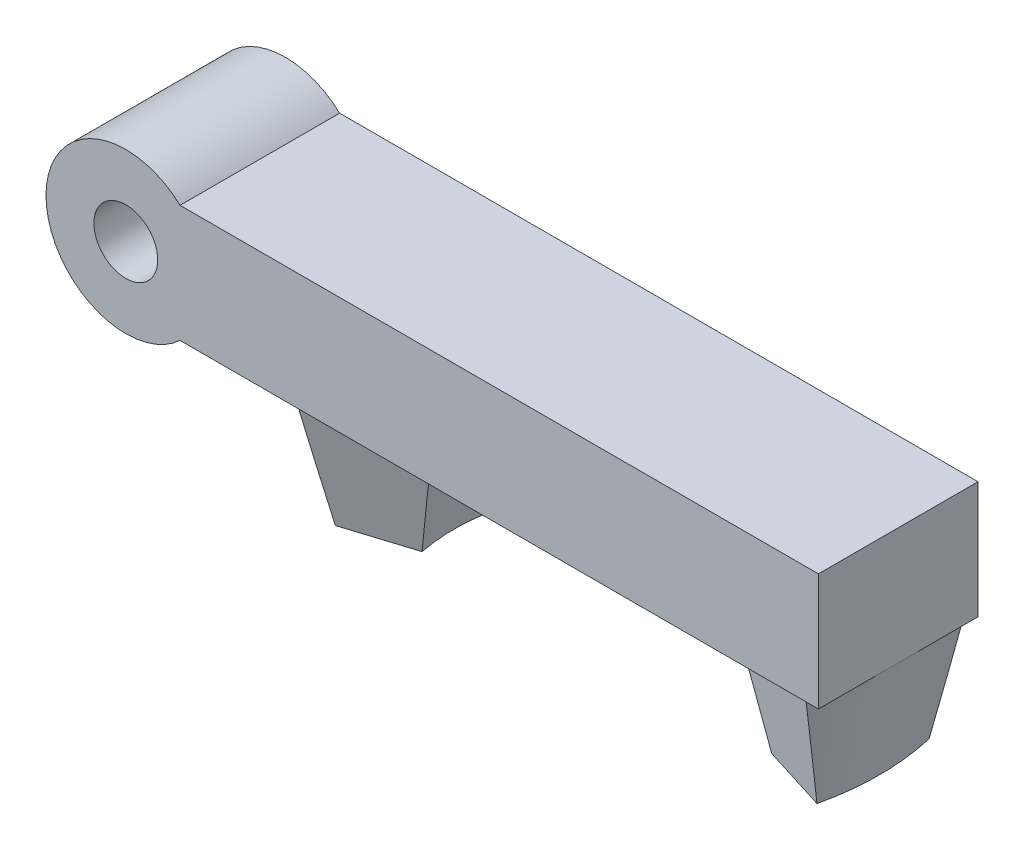
ISO-10303-21;
HEADER;
FILE_DESCRIPTION(('STEP AP214'),'2;1');
FILE_NAME('part.step','',(''),(''),'','','');
FILE_SCHEMA(('AUTOMOTIVE_DESIGN { 1 0 10303 214 1 1 1 1 }'));
ENDSEC;
DATA;
#1=APPLICATION_CONTEXT('core data for automotive mechanical design processes');
#2=APPLICATION_PROTOCOL_DEFINITION('international standard','automotive_design',2000,#1);
#3=PRODUCT_CONTEXT('',#1,'mechanical');
#4=PRODUCT('Part','Part','',(#3));
#5=PRODUCT_RELATED_PRODUCT_CATEGORY('part','',(#4));
#6=PRODUCT_DEFINITION_FORMATION('','',#4);
#7=PRODUCT_DEFINITION_CONTEXT('part definition',#1,'design');
#8=PRODUCT_DEFINITION('design','',#6,#7);
#9=PRODUCT_DEFINITION_SHAPE('','',#8);
#10=(LENGTH_UNIT() NAMED_UNIT(*) SI_UNIT(.MILLI.,.METRE.));
#11=(NAMED_UNIT(*) PLANE_ANGLE_UNIT() SI_UNIT($,.RADIAN.));
#12=(NAMED_UNIT(*) SI_UNIT($,.STERADIAN.) SOLID_ANGLE_UNIT());
#13=UNCERTAINTY_MEASURE_WITH_UNIT(LENGTH_MEASURE(1.E-05),#10,'distance_accuracy_value','');
#14=(GEOMETRIC_REPRESENTATION_CONTEXT(3) GLOBAL_UNCERTAINTY_ASSIGNED_CONTEXT((#13)) GLOBAL_UNIT_ASSIGNED_CONTEXT((#10,
#11,#12)) REPRESENTATION_CONTEXT('',''));
#15=CARTESIAN_POINT('',(0.,0.,0.));
#16=DIRECTION('',(0.,0.,1.));
#17=DIRECTION('',(1.,0.,0.));
#18=AXIS2_PLACEMENT_3D('',#15,#16,#17);
#19=CARTESIAN_POINT('',(32.5495097567961,-2.75,7.5));
#20=DIRECTION('',(0.,1.,0.));
#21=DIRECTION('',(0.,0.,1.));
#22=AXIS2_PLACEMENT_3D('',#19,#20,#21);
#23=PLANE('',#22);
#24=CARTESIAN_POINT('',(20.0495097567961,-2.75,3.75));
#25=DIRECTION('',(0.,-1.,0.));
#26=DIRECTION('',(0.,0.,-1.));
#27=AXIS2_PLACEMENT_3D('',#24,#25,#26);
#28=CIRCLE('',#27,12.5);
#29=CARTESIAN_POINT('',(8.12526973908429,-2.75,7.5));
#30=VERTEX_POINT('',#29);
#31=CARTESIAN_POINT('',(8.1252697390843,-2.75,0.));
#32=VERTEX_POINT('',#31);
#33=EDGE_CURVE('E151',#30,#32,#28,.T.);
#34=ORIENTED_EDGE('',*,*,#33,.F.);
#35=DIRECTION('',(1.,0.,0.));
#36=VECTOR('',#35,1.);
#37=CARTESIAN_POINT('',(22.0495097567963,-2.75,7.5));
#38=LINE('',#37,#36);
#39=CARTESIAN_POINT('',(2.54950975679639,-2.75,7.5));
#40=VERTEX_POINT('',#39);
#41=EDGE_CURVE('E130',#40,#30,#38,.T.);
#42=ORIENTED_EDGE('',*,*,#41,.F.);
#43=DIRECTION('',(0.,0.,-1.));
#44=VECTOR('',#43,1.);
#45=CARTESIAN_POINT('',(2.54950975679639,-2.75,7.5));
#46=LINE('',#45,#44);
#47=CARTESIAN_POINT('',(2.54950975679639,-2.75,0.));
#48=VERTEX_POINT('',#47);
#49=EDGE_CURVE('E11',#40,#48,#46,.T.);
#50=ORIENTED_EDGE('',*,*,#49,.T.);
#51=DIRECTION('',(1.,0.,0.));
#52=VECTOR('',#51,1.);
#53=CARTESIAN_POINT('',(32.5495097567961,-2.75,0.));
#54=LINE('',#53,#52);
#55=EDGE_CURVE('E152',#48,#32,#54,.T.);
#56=ORIENTED_EDGE('',*,*,#55,.T.);
#57=EDGE_LOOP('',(#34,#42,#50,#56));
#58=FACE_BOUND('',#57,.T.);
#59=ADVANCED_FACE('F39',(#58),#23,.F.);
#60=DIRECTION('',(0.953939201416946,0.,0.3));
#61=VECTOR('',#60,1.);
#62=CARTESIAN_POINT('',(8.12526973908429,-2.75,0.));
#63=LINE('',#62,#61);
#64=CARTESIAN_POINT('',(12.894965746169,-2.75,1.5));
#65=VERTEX_POINT('',#64);
#66=EDGE_CURVE('E158',#32,#65,#63,.T.);
#67=ORIENTED_EDGE('',*,*,#66,.F.);
#68=CARTESIAN_POINT('',(31.9737497745079,-2.75,0.));
#69=VERTEX_POINT('',#68);
#70=EDGE_CURVE('E370',#32,#69,#54,.T.);
#71=ORIENTED_EDGE('',*,*,#70,.T.);
#72=DIRECTION('',(0.953939201416946,0.,-0.3));
#73=VECTOR('',#72,1.);
#74=CARTESIAN_POINT('',(31.9737497745079,-2.75,0.));
#75=LINE('',#74,#73);
#76=CARTESIAN_POINT('',(27.2040537674232,-2.75,1.5));
#77=VERTEX_POINT('',#76);
#78=EDGE_CURVE('E265',#77,#69,#75,.T.);
#79=ORIENTED_EDGE('',*,*,#78,.F.);
#80=CARTESIAN_POINT('',(20.0495097567961,-2.75,3.75));
#81=DIRECTION('',(0.,1.,0.));
#82=DIRECTION('',(0.,0.,-1.));
#83=AXIS2_PLACEMENT_3D('',#80,#81,#82);
#84=CIRCLE('',#83,7.5);
#85=CARTESIAN_POINT('',(27.2040537674232,-2.75,6.));
#86=VERTEX_POINT('',#85);
#87=EDGE_CURVE('E275',#86,#77,#84,.T.);
#88=ORIENTED_EDGE('',*,*,#87,.F.);
#89=DIRECTION('',(-0.953939201416946,0.,-0.3));
#90=VECTOR('',#89,1.);
#91=CARTESIAN_POINT('',(31.9737497745079,-2.75,7.5));
#92=LINE('',#91,#90);
#93=CARTESIAN_POINT('',(31.9737497745079,-2.75,7.5));
#94=VERTEX_POINT('',#93);
#95=EDGE_CURVE('E146',#94,#86,#92,.T.);
#96=ORIENTED_EDGE('',*,*,#95,.F.);
#97=EDGE_CURVE('E133',#30,#94,#38,.T.);
#98=ORIENTED_EDGE('',*,*,#97,.F.);
#99=DIRECTION('',(-0.953939201416946,0.,0.3));
#100=VECTOR('',#99,1.);
#101=CARTESIAN_POINT('',(8.12526973908429,-2.75,7.5));
#102=LINE('',#101,#100);
#103=CARTESIAN_POINT('',(12.894965746169,-2.75,6.));
#104=VERTEX_POINT('',#103);
#105=EDGE_CURVE('E60',#104,#30,#102,.T.);
#106=ORIENTED_EDGE('',*,*,#105,.F.);
#107=CARTESIAN_POINT('',(20.0495097567961,-2.75,3.75));
#108=DIRECTION('',(0.,1.,0.));
#109=DIRECTION('',(0.,0.,1.));
#110=AXIS2_PLACEMENT_3D('',#107,#108,#109);
#111=CIRCLE('',#110,7.5);
#112=EDGE_CURVE('E55',#65,#104,#111,.T.);
#113=ORIENTED_EDGE('',*,*,#112,.F.);
#114=EDGE_LOOP('',(#67,#71,#79,#88,#96,#98,#106,#113));
#115=FACE_BOUND('',#114,.T.);
#116=ADVANCED_FACE('F144',(#115),#23,.F.);
#117=CARTESIAN_POINT('',(20.0495097567961,-2.75,3.75));
#118=DIRECTION('',(0.,-1.,0.));
#119=DIRECTION('',(0.,0.,1.));
#120=AXIS2_PLACEMENT_3D('',#117,#118,#119);
#121=CIRCLE('',#120,12.5);
#122=CARTESIAN_POINT('',(32.5495097567961,-2.75,3.75));
#123=VERTEX_POINT('',#122);
#124=EDGE_CURVE('E249',#69,#123,#121,.T.);
#125=ORIENTED_EDGE('',*,*,#124,.F.);
#126=CARTESIAN_POINT('',(32.5495097567961,-2.75,0.));
#127=VERTEX_POINT('',#126);
#128=EDGE_CURVE('E252',#69,#127,#54,.T.);
#129=ORIENTED_EDGE('',*,*,#128,.T.);
#130=DIRECTION('',(0.,0.,-1.));
#131=VECTOR('',#130,1.);
#132=CARTESIAN_POINT('',(32.5495097567961,-2.75,7.5));
#133=LINE('',#132,#131);
#134=EDGE_CURVE('E254',#123,#127,#133,.T.);
#135=ORIENTED_EDGE('',*,*,#134,.F.);
#136=EDGE_LOOP('',(#125,#129,#135));
#137=FACE_BOUND('',#136,.T.);
#138=ADVANCED_FACE('F234',(#137),#23,.F.);
#139=EDGE_CURVE('E260',#123,#94,#121,.T.);
#140=ORIENTED_EDGE('',*,*,#139,.F.);
#141=CARTESIAN_POINT('',(32.5495097567961,-2.75,7.5));
#142=VERTEX_POINT('',#141);
#143=EDGE_CURVE('E48',#142,#123,#133,.T.);
#144=ORIENTED_EDGE('',*,*,#143,.F.);
#145=EDGE_CURVE('E143',#94,#142,#38,.T.);
#146=ORIENTED_EDGE('',*,*,#145,.F.);
#147=EDGE_LOOP('',(#140,#144,#146));
#148=FACE_BOUND('',#147,.T.);
#149=ADVANCED_FACE('F238',(#148),#23,.F.);
#150=CARTESIAN_POINT('',(0.,0.,7.5));
#151=DIRECTION('',(0.,0.,1.));
#152=DIRECTION('',(1.,0.,0.));
#153=AXIS2_PLACEMENT_3D('',#150,#151,#152);
#154=PLANE('',#153);
#155=CARTESIAN_POINT('',(0.,0.,7.5));
#156=DIRECTION('',(0.,0.,1.));
#157=DIRECTION('',(1.,0.,0.));
#158=AXIS2_PLACEMENT_3D('',#155,#156,#157);
#159=CIRCLE('',#158,3.75);
#160=CARTESIAN_POINT('',(2.54950975679639,2.75,7.5));
#161=VERTEX_POINT('',#160);
#162=EDGE_CURVE('E136',#161,#40,#159,.T.);
#163=ORIENTED_EDGE('',*,*,#162,.T.);
#164=ORIENTED_EDGE('',*,*,#41,.T.);
#165=ORIENTED_EDGE('',*,*,#97,.T.);
#166=ORIENTED_EDGE('',*,*,#145,.T.);
#167=DIRECTION('',(0.,1.,0.));
#168=VECTOR('',#167,1.);
#169=CARTESIAN_POINT('',(32.5495097567961,2.75000000000022,7.5));
#170=LINE('',#169,#168);
#171=CARTESIAN_POINT('',(32.5495097567961,2.75000000000022,7.5));
#172=VERTEX_POINT('',#171);
#173=EDGE_CURVE('E141',#142,#172,#170,.T.);
#174=ORIENTED_EDGE('',*,*,#173,.T.);
#175=DIRECTION('',(-1.,0.,0.));
#176=VECTOR('',#175,1.);
#177=CARTESIAN_POINT('',(2.54950975679639,2.75,7.5));
#178=LINE('',#177,#176);
#179=EDGE_CURVE('E360',#172,#161,#178,.T.);
#180=ORIENTED_EDGE('',*,*,#179,.T.);
#181=EDGE_LOOP('',(#163,#164,#165,#166,#174,#180));
#182=FACE_BOUND('',#181,.T.);
#183=CARTESIAN_POINT('',(0.,0.,7.5));
#184=DIRECTION('',(0.,0.,1.));
#185=DIRECTION('',(1.,0.,0.));
#186=AXIS2_PLACEMENT_3D('',#183,#184,#185);
#187=CIRCLE('',#186,1.5);
#188=CARTESIAN_POINT('',(1.5,0.,7.5));
#189=VERTEX_POINT('',#188);
#190=EDGE_CURVE('E346',#189,#189,#187,.T.);
#191=ORIENTED_EDGE('',*,*,#190,.F.);
#192=EDGE_LOOP('',(#191));
#193=FACE_BOUND('',#192,.T.);
#194=ADVANCED_FACE('F131',(#182,#193),#154,.T.);
#195=CARTESIAN_POINT('',(0.,0.,0.));
#196=DIRECTION('',(0.,0.,1.));
#197=DIRECTION('',(1.,0.,0.));
#198=AXIS2_PLACEMENT_3D('',#195,#196,#197);
#199=PLANE('',#198);
#200=CARTESIAN_POINT('',(0.,0.,0.));
#201=DIRECTION('',(0.,0.,1.));
#202=DIRECTION('',(1.,0.,0.));
#203=AXIS2_PLACEMENT_3D('',#200,#201,#202);
#204=CIRCLE('',#203,3.75);
#205=CARTESIAN_POINT('',(2.54950975679639,2.75,0.));
#206=VERTEX_POINT('',#205);
#207=EDGE_CURVE('E350',#206,#48,#204,.T.);
#208=ORIENTED_EDGE('',*,*,#207,.F.);
#209=DIRECTION('',(-1.,0.,0.));
#210=VECTOR('',#209,1.);
#211=CARTESIAN_POINT('',(2.54950975679639,2.75,0.));
#212=LINE('',#211,#210);
#213=CARTESIAN_POINT('',(32.5495097567961,2.75000000000022,0.));
#214=VERTEX_POINT('',#213);
#215=EDGE_CURVE('E356',#214,#206,#212,.T.);
#216=ORIENTED_EDGE('',*,*,#215,.F.);
#217=DIRECTION('',(0.,1.,0.));
#218=VECTOR('',#217,1.);
#219=CARTESIAN_POINT('',(32.5495097567961,2.75000000000022,0.));
#220=LINE('',#219,#218);
#221=EDGE_CURVE('E369',#127,#214,#220,.T.);
#222=ORIENTED_EDGE('',*,*,#221,.F.);
#223=ORIENTED_EDGE('',*,*,#128,.F.);
#224=ORIENTED_EDGE('',*,*,#70,.F.);
#225=ORIENTED_EDGE('',*,*,#55,.F.);
#226=EDGE_LOOP('',(#208,#216,#222,#223,#224,#225));
#227=FACE_BOUND('',#226,.T.);
#228=CARTESIAN_POINT('',(0.,0.,0.));
#229=DIRECTION('',(0.,0.,1.));
#230=DIRECTION('',(1.,0.,0.));
#231=AXIS2_PLACEMENT_3D('',#228,#229,#230);
#232=CIRCLE('',#231,1.5);
#233=CARTESIAN_POINT('',(1.5,0.,0.));
#234=VERTEX_POINT('',#233);
#235=EDGE_CURVE('E351',#234,#234,#232,.T.);
#236=ORIENTED_EDGE('',*,*,#235,.T.);
#237=EDGE_LOOP('',(#236));
#238=FACE_BOUND('',#237,.T.);
#239=ADVANCED_FACE('F392',(#227,#238),#199,.F.);
#240=CARTESIAN_POINT('',(0.,0.,7.5));
#241=DIRECTION('',(0.,0.,-1.));
#242=DIRECTION('',(-1.,0.,0.));
#243=AXIS2_PLACEMENT_3D('',#240,#241,#242);
#244=CYLINDRICAL_SURFACE('',#243,3.75);
#245=ORIENTED_EDGE('',*,*,#207,.T.);
#246=ORIENTED_EDGE('',*,*,#49,.F.);
#247=ORIENTED_EDGE('',*,*,#162,.F.);
#248=DIRECTION('',(0.,0.,-1.));
#249=VECTOR('',#248,1.);
#250=CARTESIAN_POINT('',(2.54950975679639,2.75,7.5));
#251=LINE('',#250,#249);
#252=EDGE_CURVE('E363',#161,#206,#251,.T.);
#253=ORIENTED_EDGE('',*,*,#252,.T.);
#254=EDGE_LOOP('',(#245,#246,#247,#253));
#255=FACE_BOUND('',#254,.T.);
#256=ADVANCED_FACE('F41',(#255),#244,.T.);
#257=CARTESIAN_POINT('',(32.5495097567961,2.75000000000022,7.5));
#258=DIRECTION('',(-1.,0.,0.));
#259=DIRECTION('',(0.,-1.,0.));
#260=AXIS2_PLACEMENT_3D('',#257,#258,#259);
#261=PLANE('',#260);
#262=ORIENTED_EDGE('',*,*,#221,.T.);
#263=DIRECTION('',(0.,0.,-1.));
#264=VECTOR('',#263,1.);
#265=CARTESIAN_POINT('',(32.5495097567961,2.75000000000022,7.5));
#266=LINE('',#265,#264);
#267=EDGE_CURVE('E378',#172,#214,#266,.T.);
#268=ORIENTED_EDGE('',*,*,#267,.F.);
#269=ORIENTED_EDGE('',*,*,#173,.F.);
#270=ORIENTED_EDGE('',*,*,#143,.T.);
#271=ORIENTED_EDGE('',*,*,#134,.T.);
#272=EDGE_LOOP('',(#262,#268,#269,#270,#271));
#273=FACE_BOUND('',#272,.T.);
#274=ADVANCED_FACE('F387',(#273),#261,.F.);
#275=CARTESIAN_POINT('',(2.54950975679639,2.75,7.5));
#276=DIRECTION('',(0.,-1.,0.));
#277=DIRECTION('',(1.,0.,0.));
#278=AXIS2_PLACEMENT_3D('',#275,#276,#277);
#279=PLANE('',#278);
#280=ORIENTED_EDGE('',*,*,#215,.T.);
#281=ORIENTED_EDGE('',*,*,#252,.F.);
#282=ORIENTED_EDGE('',*,*,#179,.F.);
#283=ORIENTED_EDGE('',*,*,#267,.T.);
#284=EDGE_LOOP('',(#280,#281,#282,#283));
#285=FACE_BOUND('',#284,.T.);
#286=ADVANCED_FACE('F397',(#285),#279,.F.);
#287=CARTESIAN_POINT('',(0.,0.,7.5));
#288=DIRECTION('',(0.,0.,-1.));
#289=DIRECTION('',(-1.,0.,0.));
#290=AXIS2_PLACEMENT_3D('',#287,#288,#289);
#291=CYLINDRICAL_SURFACE('',#290,1.5);
#292=ORIENTED_EDGE('',*,*,#190,.T.);
#293=EDGE_LOOP('',(#292));
#294=FACE_BOUND('',#293,.T.);
#295=ORIENTED_EDGE('',*,*,#235,.F.);
#296=EDGE_LOOP('',(#295));
#297=FACE_BOUND('',#296,.T.);
#298=ADVANCED_FACE('F317',(#294,#297),#291,.F.);
#299=CARTESIAN_POINT('',(20.0495097567961,-2.75,3.75));
#300=DIRECTION('',(0.,1.,0.));
#301=DIRECTION('',(0.,0.,1.));
#302=AXIS2_PLACEMENT_3D('',#299,#300,#301);
#303=CONICAL_SURFACE('',#302,12.5,0.174532925199433);
#304=ORIENTED_EDGE('',*,*,#124,.T.);
#305=ORIENTED_EDGE('',*,*,#139,.T.);
#306=CARTESIAN_POINT('',(31.3652583437663,-7.75,6.3844337970553));
#307=CARTESIAN_POINT('',(31.4187709545416,-7.33385438493805,6.47818346468471));
#308=CARTESIAN_POINT('',(31.4715305227857,-6.91756490184091,6.57172290409124));
#309=CARTESIAN_POINT('',(31.5756220601785,-6.08472261734944,6.75840149574995));
#310=CARTESIAN_POINT('',(31.6269540450219,-5.66816981890152,6.85154065239329));
#311=CARTESIAN_POINT('',(31.7282700191053,-4.83481662819027,7.03744080613842));
#312=CARTESIAN_POINT('',(31.778254009838,-4.41801623620162,7.13020180365884));
#313=CARTESIAN_POINT('',(31.8769435955991,-3.58417963394504,7.31536535071306));
#314=CARTESIAN_POINT('',(31.9256491765628,-3.1671434211342,7.40776789629375));
#315=CARTESIAN_POINT('',(31.9737497745079,-2.75,7.5));
#316=B_SPLINE_CURVE_WITH_KNOTS('',3,(#306,#307,#308,#309,#310,#311,#312,#313,#314,#315),
.UNSPECIFIED.,.F.,.F.,(4,2,2,2,4),(0.,1.28975380623245,2.57949342733426,3.86923162029498,
5.15898399671654),.UNSPECIFIED.);
#317=CARTESIAN_POINT('',(31.3652583437663,-7.75,6.3844337970553));
#318=VERTEX_POINT('',#317);
#319=EDGE_CURVE('E296',#318,#94,#316,.T.);
#320=ORIENTED_EDGE('',*,*,#319,.F.);
#321=CARTESIAN_POINT('',(20.0495097567961,-7.75,3.75));
#322=DIRECTION('',(0.,1.,0.));
#323=DIRECTION('',(0.,0.,1.));
#324=AXIS2_PLACEMENT_3D('',#321,#322,#323);
#325=CIRCLE('',#324,11.6183650964577);
#326=CARTESIAN_POINT('',(31.3652583437663,-7.75,1.1155662029447));
#327=VERTEX_POINT('',#326);
#328=EDGE_CURVE('E274',#327,#318,#325,.F.);
#329=ORIENTED_EDGE('',*,*,#328,.F.);
#330=CARTESIAN_POINT('',(31.3652583437663,-7.75,1.1155662029447));
#331=CARTESIAN_POINT('',(31.4187709545416,-7.33385438493805,1.02181653531529));
#332=CARTESIAN_POINT('',(31.4715305227857,-6.91756490184091,0.928277095908757));
#333=CARTESIAN_POINT('',(31.5756220601785,-6.08472261734944,0.741598504250052));
#334=CARTESIAN_POINT('',(31.6269540450219,-5.66816981890152,0.648459347606707));
#335=CARTESIAN_POINT('',(31.7282700191053,-4.83481662819027,0.462559193861575));
#336=CARTESIAN_POINT('',(31.778254009838,-4.41801623620162,0.369798196341163));
#337=CARTESIAN_POINT('',(31.8769435955991,-3.58417963394504,0.184634649286935));
#338=CARTESIAN_POINT('',(31.9256491765628,-3.1671434211342,0.0922321037062485));
#339=CARTESIAN_POINT('',(31.9737497745079,-2.75,0.));
#340=B_SPLINE_CURVE_WITH_KNOTS('',3,(#330,#331,#332,#333,#334,#335,#336,#337,#338,#339),
.UNSPECIFIED.,.F.,.F.,(4,2,2,2,4),(0.,1.28975380623245,2.57949342733426,3.86923162029498,
5.15898399671654),.UNSPECIFIED.);
#341=EDGE_CURVE('E268',#327,#69,#340,.T.);
#342=ORIENTED_EDGE('',*,*,#341,.T.);
#343=EDGE_LOOP('',(#304,#305,#320,#329,#342));
#344=FACE_BOUND('',#343,.T.);
#345=ADVANCED_FACE('F277',(#344),#303,.T.);
#346=CARTESIAN_POINT('',(31.9737497745079,-2.75,7.5));
#347=DIRECTION('',(-0.295442325903662,-0.173648177666931,0.939446721457682));
#348=DIRECTION('',(0.953939201416946,0.,0.3));
#349=AXIS2_PLACEMENT_3D('',#346,#347,#348);
#350=PLANE('',#349);
#351=ORIENTED_EDGE('',*,*,#95,.T.);
#352=CARTESIAN_POINT('',(28.2652150050707,-7.75,5.40951526951467));
#353=CARTESIAN_POINT('',(28.1799973032459,-7.33278870521878,5.45983325341501));
#354=CARTESIAN_POINT('',(28.0940558771818,-6.91569467324918,5.50990196160788));
#355=CARTESIAN_POINT('',(27.9206108310477,-6.08177487409727,5.60949850440233));
#356=CARTESIAN_POINT('',(27.8331072388542,-5.66494910226513,5.65902634863015));
#357=CARTESIAN_POINT('',(27.6564198494326,-4.83158357493987,5.75750076953013));
#358=CARTESIAN_POINT('',(27.5672360477274,-4.41504382021193,5.80644734465285));
#359=CARTESIAN_POINT('',(27.3870463022499,-3.58227714061988,5.90370963397487));
#360=CARTESIAN_POINT('',(27.2960403260113,-3.16605022146699,5.95202533690832));
#361=CARTESIAN_POINT('',(27.2040537674232,-2.75,6.));
#362=B_SPLINE_CURVE_WITH_KNOTS('',3,(#352,#353,#354,#355,#356,#357,#358,#359,#360,#361),
.UNSPECIFIED.,.F.,.F.,(4,2,2,2,4),(0.,1.28636424419166,2.57270555634036,3.85905029661675,
5.14541797657267),.UNSPECIFIED.);
#363=CARTESIAN_POINT('',(28.2652150050707,-7.75,5.40951526951467));
#364=VERTEX_POINT('',#363);
#365=EDGE_CURVE('E285',#364,#86,#362,.T.);
#366=ORIENTED_EDGE('',*,*,#365,.F.);
#367=DIRECTION('',(0.953939201416946,0.,0.3));
#368=VECTOR('',#367,1.);
#369=CARTESIAN_POINT('',(20.3140002278588,-7.75,2.90897390417353));
#370=LINE('',#369,#368);
#371=EDGE_CURVE('E342',#318,#364,#370,.F.);
#372=ORIENTED_EDGE('',*,*,#371,.F.);
#373=ORIENTED_EDGE('',*,*,#319,.T.);
#374=EDGE_LOOP('',(#351,#366,#372,#373));
#375=FACE_BOUND('',#374,.T.);
#376=ADVANCED_FACE('F315',(#375),#350,.T.);
#377=CARTESIAN_POINT('',(20.0495097567961,-2.75,3.75));
#378=DIRECTION('',(0.,-1.,0.));
#379=DIRECTION('',(0.,0.,-1.));
#380=AXIS2_PLACEMENT_3D('',#377,#378,#379);
#381=CONICAL_SURFACE('',#380,7.5,0.174532925199433);
#382=ORIENTED_EDGE('',*,*,#87,.T.);
#383=CARTESIAN_POINT('',(28.2652150050707,-7.75,2.09048473048533));
#384=CARTESIAN_POINT('',(28.1799973032459,-7.33278870521878,2.04016674658499));
#385=CARTESIAN_POINT('',(28.0940558771818,-6.91569467324919,1.99009803839212));
#386=CARTESIAN_POINT('',(27.9206108310477,-6.08177487409727,1.89050149559767));
#387=CARTESIAN_POINT('',(27.8331072388542,-5.66494910226514,1.84097365136985));
#388=CARTESIAN_POINT('',(27.6564198494326,-4.83158357493987,1.74249923046987));
#389=CARTESIAN_POINT('',(27.5672360477274,-4.41504382021193,1.69355265534715));
#390=CARTESIAN_POINT('',(27.3870463022499,-3.58227714061988,1.59629036602513));
#391=CARTESIAN_POINT('',(27.2960403260113,-3.16605022146699,1.54797466309168));
#392=CARTESIAN_POINT('',(27.2040537674232,-2.75,1.5));
#393=B_SPLINE_CURVE_WITH_KNOTS('',3,(#383,#384,#385,#386,#387,#388,#389,#390,#391,#392),
.UNSPECIFIED.,.F.,.F.,(4,2,2,2,4),(0.,1.28636424419166,2.57270555634036,3.85905029661675,
5.14541797657267),.UNSPECIFIED.);
#394=CARTESIAN_POINT('',(28.2652150050707,-7.75,2.09048473048533));
#395=VERTEX_POINT('',#394);
#396=EDGE_CURVE('E271',#395,#77,#393,.T.);
#397=ORIENTED_EDGE('',*,*,#396,.F.);
#398=CARTESIAN_POINT('',(20.0495097567961,-7.75,3.75));
#399=DIRECTION('',(0.,1.,0.));
#400=DIRECTION('',(0.,0.,1.));
#401=AXIS2_PLACEMENT_3D('',#398,#399,#400);
#402=CIRCLE('',#401,8.38163490354233);
#403=EDGE_CURVE('E287',#364,#395,#402,.T.);
#404=ORIENTED_EDGE('',*,*,#403,.F.);
#405=ORIENTED_EDGE('',*,*,#365,.T.);
#406=EDGE_LOOP('',(#382,#397,#404,#405));
#407=FACE_BOUND('',#406,.T.);
#408=ADVANCED_FACE('F310',(#407),#381,.F.);
#409=CARTESIAN_POINT('',(31.9737497745079,-2.75,0.));
#410=DIRECTION('',(-0.295442325903663,-0.173648177666931,-0.939446721457682));
#411=DIRECTION('',(-0.953939201416946,0.,0.3));
#412=AXIS2_PLACEMENT_3D('',#409,#410,#411);
#413=PLANE('',#412);
#414=ORIENTED_EDGE('',*,*,#78,.T.);
#415=ORIENTED_EDGE('',*,*,#341,.F.);
#416=DIRECTION('',(-0.953939201416946,0.,0.3));
#417=VECTOR('',#416,1.);
#418=CARTESIAN_POINT('',(20.3140002278588,-7.75,4.59102609582647));
#419=LINE('',#418,#417);
#420=EDGE_CURVE('E281',#395,#327,#419,.F.);
#421=ORIENTED_EDGE('',*,*,#420,.F.);
#422=ORIENTED_EDGE('',*,*,#396,.T.);
#423=EDGE_LOOP('',(#414,#415,#421,#422));
#424=FACE_BOUND('',#423,.T.);
#425=ADVANCED_FACE('F266',(#424),#413,.T.);
#426=CARTESIAN_POINT('',(20.0495097567961,-7.75,3.75));
#427=DIRECTION('',(0.,1.,0.));
#428=DIRECTION('',(0.,0.,1.));
#429=AXIS2_PLACEMENT_3D('',#426,#427,#428);
#430=PLANE('',#429);
#431=ORIENTED_EDGE('',*,*,#328,.T.);
#432=ORIENTED_EDGE('',*,*,#371,.T.);
#433=ORIENTED_EDGE('',*,*,#403,.T.);
#434=ORIENTED_EDGE('',*,*,#420,.T.);
#435=EDGE_LOOP('',(#431,#432,#433,#434));
#436=FACE_BOUND('',#435,.T.);
#437=ADVANCED_FACE('F213',(#436),#430,.F.);
#438=CARTESIAN_POINT('',(20.0495097567961,-2.75,3.75));
#439=DIRECTION('',(0.,1.,0.));
#440=DIRECTION('',(0.,0.,-1.));
#441=AXIS2_PLACEMENT_3D('',#438,#439,#440);
#442=CONICAL_SURFACE('',#441,12.5,0.174532925199433);
#443=ORIENTED_EDGE('',*,*,#33,.T.);
#444=CARTESIAN_POINT('',(8.73376116982588,-7.75,1.1155662029447));
#445=CARTESIAN_POINT('',(8.68024855905068,-7.33385438493805,1.02181653531529));
#446=CARTESIAN_POINT('',(8.6274889908065,-6.91756490184091,0.928277095908757));
#447=CARTESIAN_POINT('',(8.52339745341376,-6.08472261734944,0.741598504250052));
#448=CARTESIAN_POINT('',(8.47206546857037,-5.66816981890152,0.648459347606707));
#449=CARTESIAN_POINT('',(8.37074949448691,-4.83481662819027,0.462559193861575));
#450=CARTESIAN_POINT('',(8.32076550375425,-4.41801623620162,0.369798196341163));
#451=CARTESIAN_POINT('',(8.22207591799315,-3.58417963394504,0.184634649286935));
#452=CARTESIAN_POINT('',(8.17337033702947,-3.1671434211342,0.0922321037062482));
#453=CARTESIAN_POINT('',(8.12526973908429,-2.75,0.));
#454=B_SPLINE_CURVE_WITH_KNOTS('',3,(#444,#445,#446,#447,#448,#449,#450,#451,#452,#453),
.UNSPECIFIED.,.F.,.F.,(4,2,2,2,4),(0.,1.28975380623245,2.57949342733426,3.86923162029499,
5.15898399671654),.UNSPECIFIED.);
#455=CARTESIAN_POINT('',(8.73376116982588,-7.75,1.1155662029447));
#456=VERTEX_POINT('',#455);
#457=EDGE_CURVE('E190',#456,#32,#454,.T.);
#458=ORIENTED_EDGE('',*,*,#457,.F.);
#459=CARTESIAN_POINT('',(20.0495097567961,-7.75,3.75));
#460=DIRECTION('',(0.,-1.,0.));
#461=DIRECTION('',(0.,0.,-1.));
#462=AXIS2_PLACEMENT_3D('',#459,#460,#461);
#463=CIRCLE('',#462,11.6183650964577);
#464=CARTESIAN_POINT('',(8.73376116982588,-7.75,6.3844337970553));
#465=VERTEX_POINT('',#464);
#466=EDGE_CURVE('E170',#465,#456,#463,.T.);
#467=ORIENTED_EDGE('',*,*,#466,.F.);
#468=CARTESIAN_POINT('',(8.73376116982588,-7.75,6.3844337970553));
#469=CARTESIAN_POINT('',(8.68024855905067,-7.33385438493805,6.47818346468471));
#470=CARTESIAN_POINT('',(8.6274889908065,-6.91756490184091,6.57172290409124));
#471=CARTESIAN_POINT('',(8.52339745341376,-6.08472261734944,6.75840149574995));
#472=CARTESIAN_POINT('',(8.47206546857037,-5.66816981890152,6.85154065239329));
#473=CARTESIAN_POINT('',(8.37074949448691,-4.83481662819027,7.03744080613842));
#474=CARTESIAN_POINT('',(8.32076550375425,-4.41801623620162,7.13020180365884));
#475=CARTESIAN_POINT('',(8.22207591799315,-3.58417963394504,7.31536535071306));
#476=CARTESIAN_POINT('',(8.17337033702947,-3.1671434211342,7.40776789629375));
#477=CARTESIAN_POINT('',(8.12526973908429,-2.75,7.5));
#478=B_SPLINE_CURVE_WITH_KNOTS('',3,(#468,#469,#470,#471,#472,#473,#474,#475,#476,#477),
.UNSPECIFIED.,.F.,.F.,(4,2,2,2,4),(0.,1.28975380623245,2.57949342733426,3.86923162029499,
5.15898399671654),.UNSPECIFIED.);
#479=EDGE_CURVE('E165',#465,#30,#478,.T.);
#480=ORIENTED_EDGE('',*,*,#479,.T.);
#481=EDGE_LOOP('',(#443,#458,#467,#480));
#482=FACE_BOUND('',#481,.T.);
#483=ADVANCED_FACE('F172',(#482),#442,.T.);
#484=CARTESIAN_POINT('',(8.12526973908429,-2.75,0.));
#485=DIRECTION('',(0.295442325903663,-0.173648177666931,-0.939446721457682));
#486=DIRECTION('',(-0.953939201416946,0.,-0.3));
#487=AXIS2_PLACEMENT_3D('',#484,#485,#486);
#488=PLANE('',#487);
#489=ORIENTED_EDGE('',*,*,#66,.T.);
#490=CARTESIAN_POINT('',(11.8338045085215,-7.75,2.09048473048533));
#491=CARTESIAN_POINT('',(11.9190222103463,-7.33278870521878,2.04016674658499));
#492=CARTESIAN_POINT('',(12.0049636364104,-6.91569467324918,1.99009803839212));
#493=CARTESIAN_POINT('',(12.1784086825446,-6.08177487409727,1.89050149559767));
#494=CARTESIAN_POINT('',(12.2659122747381,-5.66494910226513,1.84097365136985));
#495=CARTESIAN_POINT('',(12.4425996641596,-4.83158357493987,1.74249923046987));
#496=CARTESIAN_POINT('',(12.5317834658648,-4.41504382021193,1.69355265534715));
#497=CARTESIAN_POINT('',(12.7119732113423,-3.58227714061988,1.59629036602513));
#498=CARTESIAN_POINT('',(12.8029791875809,-3.16605022146699,1.54797466309168));
#499=CARTESIAN_POINT('',(12.894965746169,-2.75000000000001,1.5));
#500=B_SPLINE_CURVE_WITH_KNOTS('',3,(#490,#491,#492,#493,#494,#495,#496,#497,#498,#499),
.UNSPECIFIED.,.F.,.F.,(4,2,2,2,4),(0.,1.28636424419166,2.57270555634036,3.85905029661675,
5.14541797657267),.UNSPECIFIED.);
#501=CARTESIAN_POINT('',(11.8338045085215,-7.75,2.09048473048533));
#502=VERTEX_POINT('',#501);
#503=EDGE_CURVE('E179',#502,#65,#500,.T.);
#504=ORIENTED_EDGE('',*,*,#503,.F.);
#505=DIRECTION('',(-0.953939201416946,0.,-0.3));
#506=VECTOR('',#505,1.);
#507=CARTESIAN_POINT('',(7.86077926802159,-7.75,0.841026095826471));
#508=LINE('',#507,#506);
#509=EDGE_CURVE('E495',#456,#502,#508,.F.);
#510=ORIENTED_EDGE('',*,*,#509,.F.);
#511=ORIENTED_EDGE('',*,*,#457,.T.);
#512=EDGE_LOOP('',(#489,#504,#510,#511));
#513=FACE_BOUND('',#512,.T.);
#514=ADVANCED_FACE('F211',(#513),#488,.T.);
#515=CARTESIAN_POINT('',(20.0495097567961,-2.75,3.75));
#516=DIRECTION('',(0.,-1.,0.));
#517=DIRECTION('',(0.,0.,1.));
#518=AXIS2_PLACEMENT_3D('',#515,#516,#517);
#519=CONICAL_SURFACE('',#518,7.5,0.174532925199433);
#520=ORIENTED_EDGE('',*,*,#112,.T.);
#521=CARTESIAN_POINT('',(11.8338045085215,-7.75,5.40951526951467));
#522=CARTESIAN_POINT('',(11.9190222103463,-7.33278870521878,5.45983325341501));
#523=CARTESIAN_POINT('',(12.0049636364104,-6.91569467324918,5.50990196160788));
#524=CARTESIAN_POINT('',(12.1784086825446,-6.08177487409727,5.60949850440233));
#525=CARTESIAN_POINT('',(12.2659122747381,-5.66494910226513,5.65902634863015));
#526=CARTESIAN_POINT('',(12.4425996641596,-4.83158357493987,5.75750076953013));
#527=CARTESIAN_POINT('',(12.5317834658648,-4.41504382021193,5.80644734465285));
#528=CARTESIAN_POINT('',(12.7119732113423,-3.58227714061988,5.90370963397487));
#529=CARTESIAN_POINT('',(12.8029791875809,-3.16605022146699,5.95202533690832));
#530=CARTESIAN_POINT('',(12.894965746169,-2.75,6.));
#531=B_SPLINE_CURVE_WITH_KNOTS('',3,(#521,#522,#523,#524,#525,#526,#527,#528,#529,#530),
.UNSPECIFIED.,.F.,.F.,(4,2,2,2,4),(0.,1.28636424419166,2.57270555634036,3.85905029661675,
5.14541797657267),.UNSPECIFIED.);
#532=CARTESIAN_POINT('',(11.8338045085215,-7.75,5.40951526951467));
#533=VERTEX_POINT('',#532);
#534=EDGE_CURVE('E168',#533,#104,#531,.T.);
#535=ORIENTED_EDGE('',*,*,#534,.F.);
#536=CARTESIAN_POINT('',(20.0495097567961,-7.75,3.75));
#537=DIRECTION('',(0.,-1.,0.));
#538=DIRECTION('',(0.,0.,-1.));
#539=AXIS2_PLACEMENT_3D('',#536,#537,#538);
#540=CIRCLE('',#539,8.38163490354233);
#541=EDGE_CURVE('E181',#502,#533,#540,.F.);
#542=ORIENTED_EDGE('',*,*,#541,.F.);
#543=ORIENTED_EDGE('',*,*,#503,.T.);
#544=EDGE_LOOP('',(#520,#535,#542,#543));
#545=FACE_BOUND('',#544,.T.);
#546=ADVANCED_FACE('F206',(#545),#519,.F.);
#547=CARTESIAN_POINT('',(8.12526973908429,-2.75,7.5));
#548=DIRECTION('',(0.295442325903662,-0.173648177666931,0.939446721457682));
#549=DIRECTION('',(0.953939201416946,0.,-0.3));
#550=AXIS2_PLACEMENT_3D('',#547,#548,#549);
#551=PLANE('',#550);
#552=ORIENTED_EDGE('',*,*,#105,.T.);
#553=ORIENTED_EDGE('',*,*,#479,.F.);
#554=DIRECTION('',(0.953939201416946,0.,-0.3));
#555=VECTOR('',#554,1.);
#556=CARTESIAN_POINT('',(7.86077926802159,-7.75,6.65897390417353));
#557=LINE('',#556,#555);
#558=EDGE_CURVE('E175',#533,#465,#557,.F.);
#559=ORIENTED_EDGE('',*,*,#558,.F.);
#560=ORIENTED_EDGE('',*,*,#534,.T.);
#561=EDGE_LOOP('',(#552,#553,#559,#560));
#562=FACE_BOUND('',#561,.T.);
#563=ADVANCED_FACE('F163',(#562),#551,.T.);
#564=CARTESIAN_POINT('',(20.0495097567961,-7.75,3.75));
#565=DIRECTION('',(0.,-1.,0.));
#566=DIRECTION('',(0.,0.,-1.));
#567=AXIS2_PLACEMENT_3D('',#564,#565,#566);
#568=PLANE('',#567);
#569=ORIENTED_EDGE('',*,*,#466,.T.);
#570=ORIENTED_EDGE('',*,*,#509,.T.);
#571=ORIENTED_EDGE('',*,*,#541,.T.);
#572=ORIENTED_EDGE('',*,*,#558,.T.);
#573=EDGE_LOOP('',(#569,#570,#571,#572));
#574=FACE_BOUND('',#573,.T.);
#575=ADVANCED_FACE('F205',(#574),#568,.T.);
#576=CLOSED_SHELL('',(#59,#116,#138,#149,#194,#239,#256,#274,#286,#298,#345,#376,#408,#425,#437,
#483,#514,#546,#563,#575));
#577=MANIFOLD_SOLID_BREP('B2',#576);
#578=ADVANCED_BREP_SHAPE_REPRESENTATION('',(#18,#577),#14);
#579=SHAPE_DEFINITION_REPRESENTATION(#9,#578);
ENDSEC;
END-ISO-10303-21;
